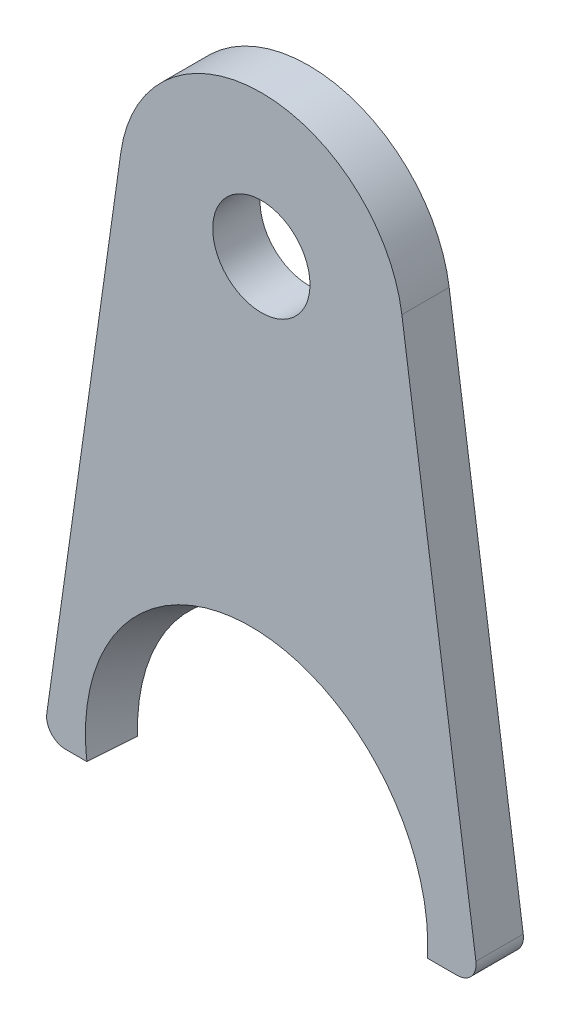
ISO-10303-21;
HEADER;
FILE_DESCRIPTION(('STEP AP214'),'2;1');
FILE_NAME('part.step','',(''),(''),'','','');
FILE_SCHEMA(('AUTOMOTIVE_DESIGN { 1 0 10303 214 1 1 1 1 }'));
ENDSEC;
DATA;
#1=APPLICATION_CONTEXT('core data for automotive mechanical design processes');
#2=APPLICATION_PROTOCOL_DEFINITION('international standard','automotive_design',2000,#1);
#3=PRODUCT_CONTEXT('',#1,'mechanical');
#4=PRODUCT('Part','Part','',(#3));
#5=PRODUCT_RELATED_PRODUCT_CATEGORY('part','',(#4));
#6=PRODUCT_DEFINITION_FORMATION('','',#4);
#7=PRODUCT_DEFINITION_CONTEXT('part definition',#1,'design');
#8=PRODUCT_DEFINITION('design','',#6,#7);
#9=PRODUCT_DEFINITION_SHAPE('','',#8);
#10=(LENGTH_UNIT() NAMED_UNIT(*) SI_UNIT(.MILLI.,.METRE.));
#11=(NAMED_UNIT(*) PLANE_ANGLE_UNIT() SI_UNIT($,.RADIAN.));
#12=(NAMED_UNIT(*) SI_UNIT($,.STERADIAN.) SOLID_ANGLE_UNIT());
#13=UNCERTAINTY_MEASURE_WITH_UNIT(LENGTH_MEASURE(1.E-05),#10,'distance_accuracy_value','');
#14=(GEOMETRIC_REPRESENTATION_CONTEXT(3) GLOBAL_UNCERTAINTY_ASSIGNED_CONTEXT((#13)) GLOBAL_UNIT_ASSIGNED_CONTEXT((#10,
#11,#12)) REPRESENTATION_CONTEXT('',''));
#15=CARTESIAN_POINT('',(0.,0.,0.));
#16=DIRECTION('',(0.,0.,1.));
#17=DIRECTION('',(1.,0.,0.));
#18=AXIS2_PLACEMENT_3D('',#15,#16,#17);
#19=CARTESIAN_POINT('',(0.,-35.211766,3.175));
#20=DIRECTION('',(0.,1.,0.));
#21=DIRECTION('',(-1.,0.,0.));
#22=AXIS2_PLACEMENT_3D('',#19,#20,#21);
#23=PLANE('',#22);
#24=DIRECTION('',(1.,0.,0.));
#25=VECTOR('',#24,1.);
#26=CARTESIAN_POINT('',(0.,-35.211766,0.));
#27=LINE('',#26,#25);
#28=CARTESIAN_POINT('',(11.4811272467094,-35.211766,0.));
#29=VERTEX_POINT('',#28);
#30=CARTESIAN_POINT('',(13.1425388214871,-35.211766,0.));
#31=VERTEX_POINT('',#30);
#32=EDGE_CURVE('E216',#29,#31,#27,.T.);
#33=ORIENTED_EDGE('',*,*,#32,.T.);
#34=DIRECTION('',(0.,0.,-1.));
#35=VECTOR('',#34,1.);
#36=CARTESIAN_POINT('',(13.1425388214871,-35.211766,3.175));
#37=LINE('',#36,#35);
#38=CARTESIAN_POINT('',(13.1425388214871,-35.211766,3.175));
#39=VERTEX_POINT('',#38);
#40=EDGE_CURVE('E12',#31,#39,#37,.F.);
#41=ORIENTED_EDGE('',*,*,#40,.T.);
#42=DIRECTION('',(1.,0.,0.));
#43=VECTOR('',#42,1.);
#44=CARTESIAN_POINT('',(0.,-35.211766,3.175));
#45=LINE('',#44,#43);
#46=CARTESIAN_POINT('',(11.1462513782271,-35.211766,3.175));
#47=VERTEX_POINT('',#46);
#48=EDGE_CURVE('E255',#47,#39,#45,.T.);
#49=ORIENTED_EDGE('',*,*,#48,.F.);
#50=CARTESIAN_POINT('',(0.00476535947821488,-35.211766,-0.047511925380217));
#51=DIRECTION('',(0.,1.,0.));
#52=DIRECTION('',(0.0997974651311546,0.,-0.995007771805525));
#53=AXIS2_PLACEMENT_3D('',#50,#51,#52);
#54=ELLIPSE('',#53,33.3709104937458,11.43);
#55=EDGE_CURVE('E226',#29,#47,#54,.F.);
#56=ORIENTED_EDGE('',*,*,#55,.F.);
#57=EDGE_LOOP('',(#33,#41,#49,#56));
#58=FACE_BOUND('',#57,.T.);
#59=ADVANCED_FACE('F138',(#58),#23,.F.);
#60=CARTESIAN_POINT('',(-9.4309575341857,1.33516477948826,3.175));
#61=DIRECTION('',(-0.990126775242593,0.140174779998767,0.));
#62=DIRECTION('',(-0.140174779998767,-0.990126775242594,0.));
#63=AXIS2_PLACEMENT_3D('',#60,#61,#62);
#64=PLANE('',#63);
#65=DIRECTION('',(0.140174779998767,0.990126775242594,0.));
#66=VECTOR('',#65,1.);
#67=CARTESIAN_POINT('',(-9.4309575341857,1.33516477948826,0.));
#68=LINE('',#67,#66);
#69=CARTESIAN_POINT('',(-14.3999998260452,-33.7637440294016,0.));
#70=VERTEX_POINT('',#69);
#71=CARTESIAN_POINT('',(-9.4309575341857,1.33516477948826,0.));
#72=VERTEX_POINT('',#71);
#73=EDGE_CURVE('E242',#70,#72,#68,.T.);
#74=ORIENTED_EDGE('',*,*,#73,.F.);
#75=DIRECTION('',(0.,0.,-1.));
#76=VECTOR('',#75,1.);
#77=CARTESIAN_POINT('',(-14.3999998260452,-33.7637440294016,3.175));
#78=LINE('',#77,#76);
#79=CARTESIAN_POINT('',(-14.3999998260452,-33.7637440294016,3.175));
#80=VERTEX_POINT('',#79);
#81=EDGE_CURVE('E264',#70,#80,#78,.F.);
#82=ORIENTED_EDGE('',*,*,#81,.T.);
#83=DIRECTION('',(0.140174779998767,0.990126775242594,0.));
#84=VECTOR('',#83,1.);
#85=CARTESIAN_POINT('',(-9.4309575341857,1.33516477948826,3.175));
#86=LINE('',#85,#84);
#87=CARTESIAN_POINT('',(-9.4309575341857,1.33516477948826,3.175));
#88=VERTEX_POINT('',#87);
#89=EDGE_CURVE('E239',#80,#88,#86,.T.);
#90=ORIENTED_EDGE('',*,*,#89,.T.);
#91=DIRECTION('',(0.,0.,-1.));
#92=VECTOR('',#91,1.);
#93=CARTESIAN_POINT('',(-9.4309575341857,1.33516477948826,3.175));
#94=LINE('',#93,#92);
#95=EDGE_CURVE('E214',#88,#72,#94,.T.);
#96=ORIENTED_EDGE('',*,*,#95,.T.);
#97=EDGE_LOOP('',(#74,#82,#90,#96));
#98=FACE_BOUND('',#97,.T.);
#99=ADVANCED_FACE('F289',(#98),#64,.T.);
#100=CARTESIAN_POINT('',(-13.1425388214871,-35.211766,3.175));
#101=VERTEX_POINT('',#100);
#102=CARTESIAN_POINT('',(-11.7066364673694,-35.211766,3.175));
#103=VERTEX_POINT('',#102);
#104=EDGE_CURVE('E250',#101,#103,#45,.T.);
#105=ORIENTED_EDGE('',*,*,#104,.F.);
#106=DIRECTION('',(0.,0.,-1.));
#107=VECTOR('',#106,1.);
#108=CARTESIAN_POINT('',(-13.1425388214871,-35.211766,0.));
#109=LINE('',#108,#107);
#110=CARTESIAN_POINT('',(-13.1425388214871,-35.211766,0.));
#111=VERTEX_POINT('',#110);
#112=EDGE_CURVE('E210',#101,#111,#109,.T.);
#113=ORIENTED_EDGE('',*,*,#112,.T.);
#114=CARTESIAN_POINT('',(-11.4799992266333,-35.211766,0.));
#115=VERTEX_POINT('',#114);
#116=EDGE_CURVE('E204',#111,#115,#27,.T.);
#117=ORIENTED_EDGE('',*,*,#116,.T.);
#118=EDGE_CURVE('E208',#103,#115,#54,.F.);
#119=ORIENTED_EDGE('',*,*,#118,.F.);
#120=EDGE_LOOP('',(#105,#113,#117,#119));
#121=FACE_BOUND('',#120,.T.);
#122=ADVANCED_FACE('F207',(#121),#23,.F.);
#123=CARTESIAN_POINT('',(9.4309575341857,1.33516477948826,3.175));
#124=DIRECTION('',(-0.990126775242593,-0.140174779998768,0.));
#125=DIRECTION('',(0.140174779998768,-0.990126775242594,0.));
#126=AXIS2_PLACEMENT_3D('',#123,#124,#125);
#127=PLANE('',#126);
#128=DIRECTION('',(-0.140174779998768,0.990126775242594,0.));
#129=VECTOR('',#128,1.);
#130=CARTESIAN_POINT('',(9.4309575341857,1.33516477948826,3.175));
#131=LINE('',#130,#129);
#132=CARTESIAN_POINT('',(14.3999998260452,-33.7637440294016,3.175));
#133=VERTEX_POINT('',#132);
#134=CARTESIAN_POINT('',(9.4309575341857,1.33516477948826,3.175));
#135=VERTEX_POINT('',#134);
#136=EDGE_CURVE('E253',#133,#135,#131,.T.);
#137=ORIENTED_EDGE('',*,*,#136,.F.);
#138=DIRECTION('',(0.,0.,-1.));
#139=VECTOR('',#138,1.);
#140=CARTESIAN_POINT('',(14.3999998260452,-33.7637440294016,3.175));
#141=LINE('',#140,#139);
#142=CARTESIAN_POINT('',(14.3999998260452,-33.7637440294016,0.));
#143=VERTEX_POINT('',#142);
#144=EDGE_CURVE('E146',#133,#143,#141,.T.);
#145=ORIENTED_EDGE('',*,*,#144,.T.);
#146=DIRECTION('',(-0.140174779998768,0.990126775242594,0.));
#147=VECTOR('',#146,1.);
#148=CARTESIAN_POINT('',(9.4309575341857,1.33516477948826,0.));
#149=LINE('',#148,#147);
#150=CARTESIAN_POINT('',(9.4309575341857,1.33516477948826,0.));
#151=VERTEX_POINT('',#150);
#152=EDGE_CURVE('E213',#143,#151,#149,.T.);
#153=ORIENTED_EDGE('',*,*,#152,.T.);
#154=DIRECTION('',(0.,0.,-1.));
#155=VECTOR('',#154,1.);
#156=CARTESIAN_POINT('',(9.4309575341857,1.33516477948826,3.175));
#157=LINE('',#156,#155);
#158=EDGE_CURVE('E232',#135,#151,#157,.T.);
#159=ORIENTED_EDGE('',*,*,#158,.F.);
#160=EDGE_LOOP('',(#137,#145,#153,#159));
#161=FACE_BOUND('',#160,.T.);
#162=ADVANCED_FACE('F272',(#161),#127,.F.);
#163=CARTESIAN_POINT('',(0.,0.,3.175));
#164=DIRECTION('',(0.,0.,-1.));
#165=DIRECTION('',(-1.,0.,0.));
#166=AXIS2_PLACEMENT_3D('',#163,#164,#165);
#167=CYLINDRICAL_SURFACE('',#166,9.525);
#168=CARTESIAN_POINT('',(0.,0.,0.));
#169=DIRECTION('',(0.,0.,1.));
#170=DIRECTION('',(1.,0.,0.));
#171=AXIS2_PLACEMENT_3D('',#168,#169,#170);
#172=CIRCLE('',#171,9.525);
#173=EDGE_CURVE('E236',#151,#72,#172,.T.);
#174=ORIENTED_EDGE('',*,*,#173,.T.);
#175=ORIENTED_EDGE('',*,*,#95,.F.);
#176=CARTESIAN_POINT('',(0.,0.,3.175));
#177=DIRECTION('',(0.,0.,1.));
#178=DIRECTION('',(1.,0.,0.));
#179=AXIS2_PLACEMENT_3D('',#176,#177,#178);
#180=CIRCLE('',#179,9.525);
#181=EDGE_CURVE('E247',#135,#88,#180,.T.);
#182=ORIENTED_EDGE('',*,*,#181,.F.);
#183=ORIENTED_EDGE('',*,*,#158,.T.);
#184=EDGE_LOOP('',(#174,#175,#182,#183));
#185=FACE_BOUND('',#184,.T.);
#186=ADVANCED_FACE('F279',(#185),#167,.T.);
#187=CARTESIAN_POINT('',(0.,0.,3.175));
#188=DIRECTION('',(0.,0.,-1.));
#189=DIRECTION('',(-1.,0.,0.));
#190=AXIS2_PLACEMENT_3D('',#187,#188,#189);
#191=CYLINDRICAL_SURFACE('',#190,3.2639);
#192=CARTESIAN_POINT('',(0.,0.,3.175));
#193=DIRECTION('',(0.,0.,1.));
#194=DIRECTION('',(1.,0.,0.));
#195=AXIS2_PLACEMENT_3D('',#192,#193,#194);
#196=CIRCLE('',#195,3.2639);
#197=CARTESIAN_POINT('',(3.2639,0.,3.175));
#198=VERTEX_POINT('',#197);
#199=EDGE_CURVE('E235',#198,#198,#196,.T.);
#200=ORIENTED_EDGE('',*,*,#199,.T.);
#201=EDGE_LOOP('',(#200));
#202=FACE_BOUND('',#201,.T.);
#203=CARTESIAN_POINT('',(0.,0.,0.));
#204=DIRECTION('',(0.,0.,1.));
#205=DIRECTION('',(1.,0.,0.));
#206=AXIS2_PLACEMENT_3D('',#203,#204,#205);
#207=CIRCLE('',#206,3.2639);
#208=CARTESIAN_POINT('',(3.2639,0.,0.));
#209=VERTEX_POINT('',#208);
#210=EDGE_CURVE('E224',#209,#209,#207,.T.);
#211=ORIENTED_EDGE('',*,*,#210,.F.);
#212=EDGE_LOOP('',(#211));
#213=FACE_BOUND('',#212,.T.);
#214=ADVANCED_FACE('F302',(#202,#213),#191,.F.);
#215=CARTESIAN_POINT('',(0.,0.,3.175));
#216=DIRECTION('',(0.,0.,1.));
#217=DIRECTION('',(1.,0.,0.));
#218=AXIS2_PLACEMENT_3D('',#215,#216,#217);
#219=PLANE('',#218);
#220=ORIENTED_EDGE('',*,*,#89,.F.);
#221=CARTESIAN_POINT('',(-13.1425388214871,-33.941766,3.175));
#222=DIRECTION('',(0.,0.,1.));
#223=DIRECTION('',(1.,0.,0.));
#224=AXIS2_PLACEMENT_3D('',#221,#222,#223);
#225=CIRCLE('',#224,1.27);
#226=EDGE_CURVE('E267',#80,#101,#225,.T.);
#227=ORIENTED_EDGE('',*,*,#226,.T.);
#228=ORIENTED_EDGE('',*,*,#104,.T.);
#229=CARTESIAN_POINT('',(-0.318446710437875,-34.0310551677774,3.17500000000004));
#230=DIRECTION('',(0.,0.,1.));
#231=DIRECTION('',(0.264029713718146,-0.964514546429401,0.));
#232=AXIS2_PLACEMENT_3D('',#229,#230,#231);
#233=ELLIPSE('',#232,12.2269199970284,11.43);
#234=EDGE_CURVE('E223',#103,#47,#233,.F.);
#235=ORIENTED_EDGE('',*,*,#234,.T.);
#236=ORIENTED_EDGE('',*,*,#48,.T.);
#237=CARTESIAN_POINT('',(13.1425388214871,-33.941766,3.175));
#238=DIRECTION('',(0.,0.,1.));
#239=DIRECTION('',(1.,0.,0.));
#240=AXIS2_PLACEMENT_3D('',#237,#238,#239);
#241=CIRCLE('',#240,1.27);
#242=EDGE_CURVE('E153',#39,#133,#241,.T.);
#243=ORIENTED_EDGE('',*,*,#242,.T.);
#244=ORIENTED_EDGE('',*,*,#136,.T.);
#245=ORIENTED_EDGE('',*,*,#181,.T.);
#246=EDGE_LOOP('',(#220,#227,#228,#235,#236,#243,#244,#245));
#247=FACE_BOUND('',#246,.T.);
#248=ORIENTED_EDGE('',*,*,#199,.F.);
#249=EDGE_LOOP('',(#248));
#250=FACE_BOUND('',#249,.T.);
#251=ADVANCED_FACE('F282',(#247,#250),#219,.T.);
#252=CARTESIAN_POINT('',(0.,0.,0.));
#253=DIRECTION('',(0.,0.,1.));
#254=DIRECTION('',(1.,0.,0.));
#255=AXIS2_PLACEMENT_3D('',#252,#253,#254);
#256=PLANE('',#255);
#257=ORIENTED_EDGE('',*,*,#116,.F.);
#258=CARTESIAN_POINT('',(-13.1425388214871,-33.941766,0.));
#259=DIRECTION('',(0.,0.,1.));
#260=DIRECTION('',(1.,0.,0.));
#261=AXIS2_PLACEMENT_3D('',#258,#259,#260);
#262=CIRCLE('',#261,1.27);
#263=EDGE_CURVE('E262',#111,#70,#262,.F.);
#264=ORIENTED_EDGE('',*,*,#263,.T.);
#265=ORIENTED_EDGE('',*,*,#73,.T.);
#266=ORIENTED_EDGE('',*,*,#173,.F.);
#267=ORIENTED_EDGE('',*,*,#152,.F.);
#268=CARTESIAN_POINT('',(13.1425388214871,-33.941766,0.));
#269=DIRECTION('',(0.,0.,1.));
#270=DIRECTION('',(1.,0.,0.));
#271=AXIS2_PLACEMENT_3D('',#268,#269,#270);
#272=CIRCLE('',#271,1.27);
#273=EDGE_CURVE('E260',#143,#31,#272,.F.);
#274=ORIENTED_EDGE('',*,*,#273,.T.);
#275=ORIENTED_EDGE('',*,*,#32,.F.);
#276=CARTESIAN_POINT('',(-1.66533453693773E-13,-35.1943578891054,0.));
#277=DIRECTION('',(0.,0.,1.));
#278=DIRECTION('',(0.264029713718146,-0.964514546429401,0.));
#279=AXIS2_PLACEMENT_3D('',#276,#277,#278);
#280=ELLIPSE('',#279,12.2269199970284,11.43);
#281=EDGE_CURVE('E220',#115,#29,#280,.F.);
#282=ORIENTED_EDGE('',*,*,#281,.F.);
#283=EDGE_LOOP('',(#257,#264,#265,#266,#267,#274,#275,#282));
#284=FACE_BOUND('',#283,.T.);
#285=ORIENTED_EDGE('',*,*,#210,.T.);
#286=EDGE_LOOP('',(#285));
#287=FACE_BOUND('',#286,.T.);
#288=ADVANCED_FACE('F228',(#284,#287),#256,.F.);
#289=CARTESIAN_POINT('',(-68.9938996245142,216.844016374224,687.887876143367));
#290=DIRECTION('',(0.0937609927810386,-0.342513879030724,-0.934822506631093));
#291=DIRECTION('',(0.902184120214354,-0.367856186909642,0.22526792711203));
#292=AXIS2_PLACEMENT_3D('',#289,#290,#291);
#293=CYLINDRICAL_SURFACE('',#292,11.43);
#294=ORIENTED_EDGE('',*,*,#118,.T.);
#295=ORIENTED_EDGE('',*,*,#281,.T.);
#296=ORIENTED_EDGE('',*,*,#55,.T.);
#297=ORIENTED_EDGE('',*,*,#234,.F.);
#298=EDGE_LOOP('',(#294,#295,#296,#297));
#299=FACE_BOUND('',#298,.T.);
#300=ADVANCED_FACE('F219',(#299),#293,.F.);
#301=CARTESIAN_POINT('',(-13.1425388214871,-33.941766,3.175));
#302=DIRECTION('',(0.,0.,1.));
#303=DIRECTION('',(1.,0.,0.));
#304=AXIS2_PLACEMENT_3D('',#301,#302,#303);
#305=CYLINDRICAL_SURFACE('',#304,1.27);
#306=ORIENTED_EDGE('',*,*,#226,.F.);
#307=ORIENTED_EDGE('',*,*,#81,.F.);
#308=ORIENTED_EDGE('',*,*,#263,.F.);
#309=ORIENTED_EDGE('',*,*,#112,.F.);
#310=EDGE_LOOP('',(#306,#307,#308,#309));
#311=FACE_BOUND('',#310,.T.);
#312=ADVANCED_FACE('F288',(#311),#305,.T.);
#313=CARTESIAN_POINT('',(13.1425388214871,-33.941766,3.175));
#314=DIRECTION('',(0.,0.,-1.));
#315=DIRECTION('',(-1.,0.,0.));
#316=AXIS2_PLACEMENT_3D('',#313,#314,#315);
#317=CYLINDRICAL_SURFACE('',#316,1.27);
#318=ORIENTED_EDGE('',*,*,#242,.F.);
#319=ORIENTED_EDGE('',*,*,#40,.F.);
#320=ORIENTED_EDGE('',*,*,#273,.F.);
#321=ORIENTED_EDGE('',*,*,#144,.F.);
#322=EDGE_LOOP('',(#318,#319,#320,#321));
#323=FACE_BOUND('',#322,.T.);
#324=ADVANCED_FACE('F140',(#323),#317,.T.);
#325=CLOSED_SHELL('',(#59,#99,#122,#162,#186,#214,#251,#288,#300,#312,#324));
#326=MANIFOLD_SOLID_BREP('B2',#325);
#327=ADVANCED_BREP_SHAPE_REPRESENTATION('',(#18,#326),#14);
#328=SHAPE_DEFINITION_REPRESENTATION(#9,#327);
ENDSEC;
END-ISO-10303-21;
